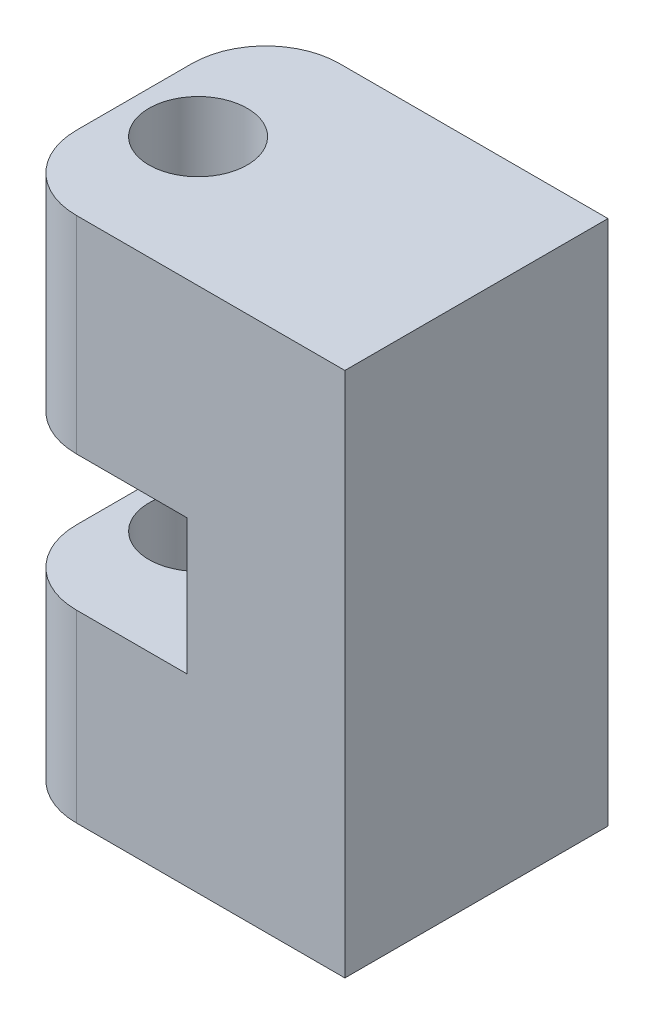
ISO-10303-21;
HEADER;
FILE_DESCRIPTION(('STEP AP214'),'2;1');
FILE_NAME('part.step','',(''),(''),'','','');
FILE_SCHEMA(('AUTOMOTIVE_DESIGN { 1 0 10303 214 1 1 1 1 }'));
ENDSEC;
DATA;
#1=APPLICATION_CONTEXT('core data for automotive mechanical design processes');
#2=APPLICATION_PROTOCOL_DEFINITION('international standard','automotive_design',2000,#1);
#3=PRODUCT_CONTEXT('',#1,'mechanical');
#4=PRODUCT('Part','Part','',(#3));
#5=PRODUCT_RELATED_PRODUCT_CATEGORY('part','',(#4));
#6=PRODUCT_DEFINITION_FORMATION('','',#4);
#7=PRODUCT_DEFINITION_CONTEXT('part definition',#1,'design');
#8=PRODUCT_DEFINITION('design','',#6,#7);
#9=PRODUCT_DEFINITION_SHAPE('','',#8);
#10=(LENGTH_UNIT() NAMED_UNIT(*) SI_UNIT(.MILLI.,.METRE.));
#11=(NAMED_UNIT(*) PLANE_ANGLE_UNIT() SI_UNIT($,.RADIAN.));
#12=(NAMED_UNIT(*) SI_UNIT($,.STERADIAN.) SOLID_ANGLE_UNIT());
#13=UNCERTAINTY_MEASURE_WITH_UNIT(LENGTH_MEASURE(1.E-05),#10,'distance_accuracy_value','');
#14=(GEOMETRIC_REPRESENTATION_CONTEXT(3) GLOBAL_UNCERTAINTY_ASSIGNED_CONTEXT((#13)) GLOBAL_UNIT_ASSIGNED_CONTEXT((#10,
#11,#12)) REPRESENTATION_CONTEXT('',''));
#15=CARTESIAN_POINT('',(0.,0.,0.));
#16=DIRECTION('',(0.,0.,1.));
#17=DIRECTION('',(1.,0.,0.));
#18=AXIS2_PLACEMENT_3D('',#15,#16,#17);
#19=CARTESIAN_POINT('',(0.,0.,-11.7));
#20=DIRECTION('',(0.,0.,-1.));
#21=DIRECTION('',(-1.,0.,0.));
#22=AXIS2_PLACEMENT_3D('',#19,#20,#21);
#23=PLANE('',#22);
#24=DIRECTION('',(0.,-1.,0.));
#25=VECTOR('',#24,1.);
#26=CARTESIAN_POINT('',(12.82,0.,-11.7));
#27=LINE('',#26,#25);
#28=CARTESIAN_POINT('',(12.82,23.4,-11.7));
#29=VERTEX_POINT('',#28);
#30=CARTESIAN_POINT('',(12.82,2.,-11.7));
#31=VERTEX_POINT('',#30);
#32=EDGE_CURVE('E162',#29,#31,#27,.T.);
#33=ORIENTED_EDGE('',*,*,#32,.T.);
#34=DIRECTION('',(-1.,0.,0.));
#35=VECTOR('',#34,1.);
#36=CARTESIAN_POINT('',(0.,2.,-11.7));
#37=LINE('',#36,#35);
#38=CARTESIAN_POINT('',(1.89997551417986,2.,-11.7));
#39=VERTEX_POINT('',#38);
#40=EDGE_CURVE('E176',#31,#39,#37,.T.);
#41=ORIENTED_EDGE('',*,*,#40,.T.);
#42=DIRECTION('',(0.,-1.,0.));
#43=VECTOR('',#42,1.);
#44=CARTESIAN_POINT('',(1.89997551417986,9.5,-11.7));
#45=LINE('',#44,#43);
#46=CARTESIAN_POINT('',(1.89997551417986,9.5,-11.7));
#47=VERTEX_POINT('',#46);
#48=EDGE_CURVE('E147',#39,#47,#45,.F.);
#49=ORIENTED_EDGE('',*,*,#48,.T.);
#50=DIRECTION('',(1.,0.,0.));
#51=VECTOR('',#50,1.);
#52=CARTESIAN_POINT('',(9.39997551417986,9.5,-11.7));
#53=LINE('',#52,#51);
#54=CARTESIAN_POINT('',(6.39997551417986,9.5,-11.7));
#55=VERTEX_POINT('',#54);
#56=EDGE_CURVE('E213',#47,#55,#53,.T.);
#57=ORIENTED_EDGE('',*,*,#56,.T.);
#58=DIRECTION('',(0.,-1.,0.));
#59=VECTOR('',#58,1.);
#60=CARTESIAN_POINT('',(6.39997551417986,15.,-11.7));
#61=LINE('',#60,#59);
#62=CARTESIAN_POINT('',(6.39997551417986,15.,-11.7));
#63=VERTEX_POINT('',#62);
#64=EDGE_CURVE('E191',#63,#55,#61,.T.);
#65=ORIENTED_EDGE('',*,*,#64,.F.);
#66=DIRECTION('',(-1.,0.,0.));
#67=VECTOR('',#66,1.);
#68=CARTESIAN_POINT('',(9.39997551417986,15.,-11.7));
#69=LINE('',#68,#67);
#70=CARTESIAN_POINT('',(1.89997551417986,15.,-11.7));
#71=VERTEX_POINT('',#70);
#72=EDGE_CURVE('E209',#63,#71,#69,.T.);
#73=ORIENTED_EDGE('',*,*,#72,.T.);
#74=DIRECTION('',(0.,-1.,0.));
#75=VECTOR('',#74,1.);
#76=CARTESIAN_POINT('',(1.89997551417986,25.4,-11.7));
#77=LINE('',#76,#75);
#78=CARTESIAN_POINT('',(1.89997551417986,23.4,-11.7));
#79=VERTEX_POINT('',#78);
#80=EDGE_CURVE('E143',#71,#79,#77,.F.);
#81=ORIENTED_EDGE('',*,*,#80,.T.);
#82=DIRECTION('',(1.,0.,0.));
#83=VECTOR('',#82,1.);
#84=CARTESIAN_POINT('',(0.,23.4,-11.7));
#85=LINE('',#84,#83);
#86=EDGE_CURVE('E180',#79,#29,#85,.T.);
#87=ORIENTED_EDGE('',*,*,#86,.T.);
#88=EDGE_LOOP('',(#33,#41,#49,#57,#65,#73,#81,#87));
#89=FACE_BOUND('',#88,.T.);
#90=ADVANCED_FACE('F38',(#89),#23,.T.);
#91=CARTESIAN_POINT('',(0.,0.,-1.));
#92=DIRECTION('',(0.,0.,-1.));
#93=DIRECTION('',(-1.,0.,0.));
#94=AXIS2_PLACEMENT_3D('',#91,#92,#93);
#95=PLANE('',#94);
#96=DIRECTION('',(-1.,0.,0.));
#97=VECTOR('',#96,1.);
#98=CARTESIAN_POINT('',(0.,2.,-1.));
#99=LINE('',#98,#97);
#100=CARTESIAN_POINT('',(12.82,2.,-1.));
#101=VERTEX_POINT('',#100);
#102=CARTESIAN_POINT('',(1.89997551417986,2.,-1.));
#103=VERTEX_POINT('',#102);
#104=EDGE_CURVE('E53',#101,#103,#99,.T.);
#105=ORIENTED_EDGE('',*,*,#104,.F.);
#106=DIRECTION('',(0.,-1.,0.));
#107=VECTOR('',#106,1.);
#108=CARTESIAN_POINT('',(12.82,0.,-1.));
#109=LINE('',#108,#107);
#110=CARTESIAN_POINT('',(12.82,23.4,-1.));
#111=VERTEX_POINT('',#110);
#112=EDGE_CURVE('E154',#111,#101,#109,.T.);
#113=ORIENTED_EDGE('',*,*,#112,.F.);
#114=DIRECTION('',(1.,0.,0.));
#115=VECTOR('',#114,1.);
#116=CARTESIAN_POINT('',(0.,23.4,-1.));
#117=LINE('',#116,#115);
#118=CARTESIAN_POINT('',(1.89997551417986,23.4,-1.));
#119=VERTEX_POINT('',#118);
#120=EDGE_CURVE('E60',#119,#111,#117,.T.);
#121=ORIENTED_EDGE('',*,*,#120,.F.);
#122=DIRECTION('',(0.,1.,0.));
#123=VECTOR('',#122,1.);
#124=CARTESIAN_POINT('',(1.89997551417986,0.,-1.));
#125=LINE('',#124,#123);
#126=CARTESIAN_POINT('',(1.89997551417986,15.,-1.));
#127=VERTEX_POINT('',#126);
#128=EDGE_CURVE('E224',#119,#127,#125,.F.);
#129=ORIENTED_EDGE('',*,*,#128,.T.);
#130=DIRECTION('',(-1.,0.,0.));
#131=VECTOR('',#130,1.);
#132=CARTESIAN_POINT('',(9.39997551417986,15.,-1.));
#133=LINE('',#132,#131);
#134=CARTESIAN_POINT('',(6.39997551417986,15.,-1.));
#135=VERTEX_POINT('',#134);
#136=EDGE_CURVE('E208',#135,#127,#133,.T.);
#137=ORIENTED_EDGE('',*,*,#136,.F.);
#138=DIRECTION('',(0.,1.,0.));
#139=VECTOR('',#138,1.);
#140=CARTESIAN_POINT('',(6.39997551417986,15.,-1.));
#141=LINE('',#140,#139);
#142=CARTESIAN_POINT('',(6.39997551417986,9.5,-1.));
#143=VERTEX_POINT('',#142);
#144=EDGE_CURVE('E197',#143,#135,#141,.T.);
#145=ORIENTED_EDGE('',*,*,#144,.F.);
#146=DIRECTION('',(1.,0.,0.));
#147=VECTOR('',#146,1.);
#148=CARTESIAN_POINT('',(9.39997551417986,9.5,-1.));
#149=LINE('',#148,#147);
#150=CARTESIAN_POINT('',(1.89997551417986,9.5,-1.));
#151=VERTEX_POINT('',#150);
#152=EDGE_CURVE('E215',#151,#143,#149,.T.);
#153=ORIENTED_EDGE('',*,*,#152,.F.);
#154=DIRECTION('',(0.,1.,0.));
#155=VECTOR('',#154,1.);
#156=CARTESIAN_POINT('',(1.89997551417986,0.,-1.));
#157=LINE('',#156,#155);
#158=EDGE_CURVE('E168',#151,#103,#157,.F.);
#159=ORIENTED_EDGE('',*,*,#158,.T.);
#160=EDGE_LOOP('',(#105,#113,#121,#129,#137,#145,#153,#159));
#161=FACE_BOUND('',#160,.T.);
#162=ADVANCED_FACE('F165',(#161),#95,.F.);
#163=CARTESIAN_POINT('',(12.82,0.,0.));
#164=DIRECTION('',(1.,0.,0.));
#165=DIRECTION('',(0.,0.,-1.));
#166=AXIS2_PLACEMENT_3D('',#163,#164,#165);
#167=PLANE('',#166);
#168=ORIENTED_EDGE('',*,*,#112,.T.);
#169=DIRECTION('',(0.,0.,-1.));
#170=VECTOR('',#169,1.);
#171=CARTESIAN_POINT('',(12.82,2.,0.));
#172=LINE('',#171,#170);
#173=EDGE_CURVE('E171',#101,#31,#172,.T.);
#174=ORIENTED_EDGE('',*,*,#173,.T.);
#175=ORIENTED_EDGE('',*,*,#32,.F.);
#176=DIRECTION('',(0.,0.,1.));
#177=VECTOR('',#176,1.);
#178=CARTESIAN_POINT('',(12.82,23.4,0.));
#179=LINE('',#178,#177);
#180=EDGE_CURVE('E46',#29,#111,#179,.T.);
#181=ORIENTED_EDGE('',*,*,#180,.T.);
#182=EDGE_LOOP('',(#168,#174,#175,#181));
#183=FACE_BOUND('',#182,.T.);
#184=ADVANCED_FACE('F159',(#183),#167,.T.);
#185=CARTESIAN_POINT('',(-1.10002448582014,0.,0.));
#186=DIRECTION('',(1.,0.,0.));
#187=DIRECTION('',(0.,0.,-1.));
#188=AXIS2_PLACEMENT_3D('',#185,#186,#187);
#189=PLANE('',#188);
#190=DIRECTION('',(0.,0.,-1.));
#191=VECTOR('',#190,1.);
#192=CARTESIAN_POINT('',(-1.10002448582014,2.,0.));
#193=LINE('',#192,#191);
#194=CARTESIAN_POINT('',(-1.10002448582014,2.,-4.));
#195=VERTEX_POINT('',#194);
#196=CARTESIAN_POINT('',(-1.10002448582014,2.,-8.7));
#197=VERTEX_POINT('',#196);
#198=EDGE_CURVE('E125',#195,#197,#193,.T.);
#199=ORIENTED_EDGE('',*,*,#198,.F.);
#200=DIRECTION('',(0.,1.,0.));
#201=VECTOR('',#200,1.);
#202=CARTESIAN_POINT('',(-1.10002448582014,0.,-4.));
#203=LINE('',#202,#201);
#204=CARTESIAN_POINT('',(-1.10002448582014,9.5,-4.));
#205=VERTEX_POINT('',#204);
#206=EDGE_CURVE('E135',#195,#205,#203,.T.);
#207=ORIENTED_EDGE('',*,*,#206,.T.);
#208=DIRECTION('',(0.,0.,-1.));
#209=VECTOR('',#208,1.);
#210=CARTESIAN_POINT('',(-1.10002448582014,9.5,-11.7));
#211=LINE('',#210,#209);
#212=CARTESIAN_POINT('',(-1.10002448582014,9.5,-8.7));
#213=VERTEX_POINT('',#212);
#214=EDGE_CURVE('E206',#205,#213,#211,.T.);
#215=ORIENTED_EDGE('',*,*,#214,.T.);
#216=DIRECTION('',(0.,-1.,0.));
#217=VECTOR('',#216,1.);
#218=CARTESIAN_POINT('',(-1.10002448582014,0.,-8.7));
#219=LINE('',#218,#217);
#220=EDGE_CURVE('E138',#213,#197,#219,.T.);
#221=ORIENTED_EDGE('',*,*,#220,.T.);
#222=EDGE_LOOP('',(#199,#207,#215,#221));
#223=FACE_BOUND('',#222,.T.);
#224=ADVANCED_FACE('F133',(#223),#189,.F.);
#225=CARTESIAN_POINT('',(1.89997551417986,0.,-8.7));
#226=DIRECTION('',(0.,1.,0.));
#227=DIRECTION('',(0.,0.,1.));
#228=AXIS2_PLACEMENT_3D('',#225,#226,#227);
#229=CYLINDRICAL_SURFACE('',#228,3.);
#230=ORIENTED_EDGE('',*,*,#48,.F.);
#231=CARTESIAN_POINT('',(1.89997551417986,2.,-8.7));
#232=DIRECTION('',(0.,-1.,0.));
#233=DIRECTION('',(0.,0.,-1.));
#234=AXIS2_PLACEMENT_3D('',#231,#232,#233);
#235=CIRCLE('',#234,3.);
#236=EDGE_CURVE('E169',#39,#197,#235,.F.);
#237=ORIENTED_EDGE('',*,*,#236,.T.);
#238=ORIENTED_EDGE('',*,*,#220,.F.);
#239=CARTESIAN_POINT('',(1.89997551417986,9.5,-8.7));
#240=DIRECTION('',(0.,-1.,0.));
#241=DIRECTION('',(0.,0.,-1.));
#242=AXIS2_PLACEMENT_3D('',#239,#240,#241);
#243=CIRCLE('',#242,3.);
#244=EDGE_CURVE('E152',#47,#213,#243,.F.);
#245=ORIENTED_EDGE('',*,*,#244,.F.);
#246=EDGE_LOOP('',(#230,#237,#238,#245));
#247=FACE_BOUND('',#246,.T.);
#248=ADVANCED_FACE('F238',(#247),#229,.T.);
#249=CARTESIAN_POINT('',(1.89997551417986,0.,-4.));
#250=DIRECTION('',(0.,1.,0.));
#251=DIRECTION('',(0.,0.,1.));
#252=AXIS2_PLACEMENT_3D('',#249,#250,#251);
#253=CYLINDRICAL_SURFACE('',#252,3.);
#254=ORIENTED_EDGE('',*,*,#206,.F.);
#255=CARTESIAN_POINT('',(1.89997551417986,2.,-4.));
#256=DIRECTION('',(0.,-1.,0.));
#257=DIRECTION('',(0.,0.,-1.));
#258=AXIS2_PLACEMENT_3D('',#255,#256,#257);
#259=CIRCLE('',#258,3.);
#260=EDGE_CURVE('E11',#195,#103,#259,.F.);
#261=ORIENTED_EDGE('',*,*,#260,.T.);
#262=ORIENTED_EDGE('',*,*,#158,.F.);
#263=CARTESIAN_POINT('',(1.89997551417986,9.5,-4.));
#264=DIRECTION('',(0.,-1.,0.));
#265=DIRECTION('',(0.,0.,-1.));
#266=AXIS2_PLACEMENT_3D('',#263,#264,#265);
#267=CIRCLE('',#266,3.);
#268=EDGE_CURVE('E141',#205,#151,#267,.F.);
#269=ORIENTED_EDGE('',*,*,#268,.F.);
#270=EDGE_LOOP('',(#254,#261,#262,#269));
#271=FACE_BOUND('',#270,.T.);
#272=ADVANCED_FACE('F40',(#271),#253,.T.);
#273=CARTESIAN_POINT('',(-1.10002448582014,0.,0.));
#274=DIRECTION('',(1.,0.,0.));
#275=DIRECTION('',(0.,0.,-1.));
#276=AXIS2_PLACEMENT_3D('',#273,#274,#275);
#277=PLANE('',#276);
#278=DIRECTION('',(0.,0.,1.));
#279=VECTOR('',#278,1.);
#280=CARTESIAN_POINT('',(-1.10002448582014,23.4,0.));
#281=LINE('',#280,#279);
#282=CARTESIAN_POINT('',(-1.10002448582014,23.4,-8.7));
#283=VERTEX_POINT('',#282);
#284=CARTESIAN_POINT('',(-1.10002448582014,23.4,-4.));
#285=VERTEX_POINT('',#284);
#286=EDGE_CURVE('E188',#283,#285,#281,.T.);
#287=ORIENTED_EDGE('',*,*,#286,.F.);
#288=DIRECTION('',(0.,-1.,0.));
#289=VECTOR('',#288,1.);
#290=CARTESIAN_POINT('',(-1.10002448582014,15.,-8.7));
#291=LINE('',#290,#289);
#292=CARTESIAN_POINT('',(-1.10002448582014,15.,-8.7));
#293=VERTEX_POINT('',#292);
#294=EDGE_CURVE('E212',#283,#293,#291,.T.);
#295=ORIENTED_EDGE('',*,*,#294,.T.);
#296=DIRECTION('',(0.,0.,1.));
#297=VECTOR('',#296,1.);
#298=CARTESIAN_POINT('',(-1.10002448582014,15.,-11.7));
#299=LINE('',#298,#297);
#300=CARTESIAN_POINT('',(-1.10002448582014,15.,-4.));
#301=VERTEX_POINT('',#300);
#302=EDGE_CURVE('E203',#293,#301,#299,.T.);
#303=ORIENTED_EDGE('',*,*,#302,.T.);
#304=DIRECTION('',(0.,1.,0.));
#305=VECTOR('',#304,1.);
#306=CARTESIAN_POINT('',(-1.10002448582014,0.,-4.));
#307=LINE('',#306,#305);
#308=EDGE_CURVE('E220',#301,#285,#307,.T.);
#309=ORIENTED_EDGE('',*,*,#308,.T.);
#310=EDGE_LOOP('',(#287,#295,#303,#309));
#311=FACE_BOUND('',#310,.T.);
#312=ADVANCED_FACE('F248',(#311),#277,.F.);
#313=CARTESIAN_POINT('',(1.89997551417986,0.,-4.));
#314=DIRECTION('',(0.,1.,0.));
#315=DIRECTION('',(0.,0.,1.));
#316=AXIS2_PLACEMENT_3D('',#313,#314,#315);
#317=CYLINDRICAL_SURFACE('',#316,3.);
#318=ORIENTED_EDGE('',*,*,#128,.F.);
#319=CARTESIAN_POINT('',(1.89997551417986,23.4,-4.));
#320=DIRECTION('',(0.,1.,0.));
#321=DIRECTION('',(0.,0.,1.));
#322=AXIS2_PLACEMENT_3D('',#319,#320,#321);
#323=CIRCLE('',#322,3.);
#324=EDGE_CURVE('E185',#119,#285,#323,.F.);
#325=ORIENTED_EDGE('',*,*,#324,.T.);
#326=ORIENTED_EDGE('',*,*,#308,.F.);
#327=CARTESIAN_POINT('',(1.89997551417986,15.,-4.));
#328=DIRECTION('',(0.,1.,0.));
#329=DIRECTION('',(0.,0.,1.));
#330=AXIS2_PLACEMENT_3D('',#327,#328,#329);
#331=CIRCLE('',#330,3.);
#332=EDGE_CURVE('E228',#127,#301,#331,.F.);
#333=ORIENTED_EDGE('',*,*,#332,.F.);
#334=EDGE_LOOP('',(#318,#325,#326,#333));
#335=FACE_BOUND('',#334,.T.);
#336=ADVANCED_FACE('F251',(#335),#317,.T.);
#337=CARTESIAN_POINT('',(1.89997551417986,0.,-8.7));
#338=DIRECTION('',(0.,1.,0.));
#339=DIRECTION('',(0.,0.,1.));
#340=AXIS2_PLACEMENT_3D('',#337,#338,#339);
#341=CYLINDRICAL_SURFACE('',#340,3.);
#342=ORIENTED_EDGE('',*,*,#294,.F.);
#343=CARTESIAN_POINT('',(1.89997551417986,23.4,-8.7));
#344=DIRECTION('',(0.,1.,0.));
#345=DIRECTION('',(0.,0.,1.));
#346=AXIS2_PLACEMENT_3D('',#343,#344,#345);
#347=CIRCLE('',#346,3.);
#348=EDGE_CURVE('E182',#283,#79,#347,.F.);
#349=ORIENTED_EDGE('',*,*,#348,.T.);
#350=ORIENTED_EDGE('',*,*,#80,.F.);
#351=CARTESIAN_POINT('',(1.89997551417986,15.,-8.7));
#352=DIRECTION('',(0.,1.,0.));
#353=DIRECTION('',(0.,0.,1.));
#354=AXIS2_PLACEMENT_3D('',#351,#352,#353);
#355=CIRCLE('',#354,3.);
#356=EDGE_CURVE('E226',#293,#71,#355,.F.);
#357=ORIENTED_EDGE('',*,*,#356,.F.);
#358=EDGE_LOOP('',(#342,#349,#350,#357));
#359=FACE_BOUND('',#358,.T.);
#360=ADVANCED_FACE('F244',(#359),#341,.T.);
#361=CARTESIAN_POINT('',(9.39997551417986,15.,-15.665098237759));
#362=DIRECTION('',(0.,1.,0.));
#363=DIRECTION('',(0.,0.,1.));
#364=AXIS2_PLACEMENT_3D('',#361,#362,#363);
#365=PLANE('',#364);
#366=CARTESIAN_POINT('',(1.59997551417986,15.,-6.25));
#367=DIRECTION('',(0.,1.,0.));
#368=DIRECTION('',(0.,0.,1.));
#369=AXIS2_PLACEMENT_3D('',#366,#367,#368);
#370=CIRCLE('',#369,2.);
#371=CARTESIAN_POINT('',(1.59997551417986,15.,-4.25));
#372=VERTEX_POINT('',#371);
#373=EDGE_CURVE('E139',#372,#372,#370,.T.);
#374=ORIENTED_EDGE('',*,*,#373,.T.);
#375=EDGE_LOOP('',(#374));
#376=FACE_BOUND('',#375,.T.);
#377=ORIENTED_EDGE('',*,*,#136,.T.);
#378=ORIENTED_EDGE('',*,*,#332,.T.);
#379=ORIENTED_EDGE('',*,*,#302,.F.);
#380=ORIENTED_EDGE('',*,*,#356,.T.);
#381=ORIENTED_EDGE('',*,*,#72,.F.);
#382=DIRECTION('',(0.,0.,-1.));
#383=VECTOR('',#382,1.);
#384=CARTESIAN_POINT('',(6.39997551417986,15.,-11.7));
#385=LINE('',#384,#383);
#386=EDGE_CURVE('E200',#135,#63,#385,.T.);
#387=ORIENTED_EDGE('',*,*,#386,.F.);
#388=EDGE_LOOP('',(#377,#378,#379,#380,#381,#387));
#389=FACE_BOUND('',#388,.T.);
#390=ADVANCED_FACE('F256',(#376,#389),#365,.F.);
#391=CARTESIAN_POINT('',(9.39997551417986,9.5,-15.665098237759));
#392=DIRECTION('',(0.,-1.,0.));
#393=DIRECTION('',(0.,0.,-1.));
#394=AXIS2_PLACEMENT_3D('',#391,#392,#393);
#395=PLANE('',#394);
#396=CARTESIAN_POINT('',(1.59997551417986,9.5,-6.25));
#397=DIRECTION('',(0.,-1.,0.));
#398=DIRECTION('',(0.,0.,-1.));
#399=AXIS2_PLACEMENT_3D('',#396,#397,#398);
#400=CIRCLE('',#399,2.);
#401=CARTESIAN_POINT('',(1.59997551417986,9.5,-8.25));
#402=VERTEX_POINT('',#401);
#403=EDGE_CURVE('E317',#402,#402,#400,.T.);
#404=ORIENTED_EDGE('',*,*,#403,.T.);
#405=EDGE_LOOP('',(#404));
#406=FACE_BOUND('',#405,.T.);
#407=ORIENTED_EDGE('',*,*,#56,.F.);
#408=ORIENTED_EDGE('',*,*,#244,.T.);
#409=ORIENTED_EDGE('',*,*,#214,.F.);
#410=ORIENTED_EDGE('',*,*,#268,.T.);
#411=ORIENTED_EDGE('',*,*,#152,.T.);
#412=DIRECTION('',(0.,0.,1.));
#413=VECTOR('',#412,1.);
#414=CARTESIAN_POINT('',(6.39997551417986,9.5,-11.7));
#415=LINE('',#414,#413);
#416=EDGE_CURVE('E194',#55,#143,#415,.T.);
#417=ORIENTED_EDGE('',*,*,#416,.F.);
#418=EDGE_LOOP('',(#407,#408,#409,#410,#411,#417));
#419=FACE_BOUND('',#418,.T.);
#420=ADVANCED_FACE('F237',(#406,#419),#395,.F.);
#421=CARTESIAN_POINT('',(6.39997551417986,0.,0.));
#422=DIRECTION('',(-1.,0.,0.));
#423=DIRECTION('',(0.,0.,1.));
#424=AXIS2_PLACEMENT_3D('',#421,#422,#423);
#425=PLANE('',#424);
#426=ORIENTED_EDGE('',*,*,#64,.T.);
#427=ORIENTED_EDGE('',*,*,#416,.T.);
#428=ORIENTED_EDGE('',*,*,#144,.T.);
#429=ORIENTED_EDGE('',*,*,#386,.T.);
#430=EDGE_LOOP('',(#426,#427,#428,#429));
#431=FACE_BOUND('',#430,.T.);
#432=ADVANCED_FACE('F258',(#431),#425,.T.);
#433=CARTESIAN_POINT('',(0.,23.4,0.));
#434=DIRECTION('',(0.,1.,0.));
#435=DIRECTION('',(0.,0.,1.));
#436=AXIS2_PLACEMENT_3D('',#433,#434,#435);
#437=PLANE('',#436);
#438=CARTESIAN_POINT('',(1.59997551417986,23.4,-6.25));
#439=DIRECTION('',(0.,1.,0.));
#440=DIRECTION('',(0.,0.,1.));
#441=AXIS2_PLACEMENT_3D('',#438,#439,#440);
#442=CIRCLE('',#441,2.);
#443=CARTESIAN_POINT('',(1.59997551417986,23.4,-4.25));
#444=VERTEX_POINT('',#443);
#445=EDGE_CURVE('E314',#444,#444,#442,.T.);
#446=ORIENTED_EDGE('',*,*,#445,.F.);
#447=EDGE_LOOP('',(#446));
#448=FACE_BOUND('',#447,.T.);
#449=ORIENTED_EDGE('',*,*,#286,.T.);
#450=ORIENTED_EDGE('',*,*,#324,.F.);
#451=ORIENTED_EDGE('',*,*,#120,.T.);
#452=ORIENTED_EDGE('',*,*,#180,.F.);
#453=ORIENTED_EDGE('',*,*,#86,.F.);
#454=ORIENTED_EDGE('',*,*,#348,.F.);
#455=EDGE_LOOP('',(#449,#450,#451,#452,#453,#454));
#456=FACE_BOUND('',#455,.T.);
#457=ADVANCED_FACE('F240',(#448,#456),#437,.T.);
#458=CARTESIAN_POINT('',(0.,2.,0.));
#459=DIRECTION('',(0.,-1.,0.));
#460=DIRECTION('',(0.,0.,-1.));
#461=AXIS2_PLACEMENT_3D('',#458,#459,#460);
#462=PLANE('',#461);
#463=CARTESIAN_POINT('',(1.59997551417986,2.,-6.25));
#464=DIRECTION('',(0.,-1.,0.));
#465=DIRECTION('',(0.,0.,-1.));
#466=AXIS2_PLACEMENT_3D('',#463,#464,#465);
#467=CIRCLE('',#466,2.);
#468=CARTESIAN_POINT('',(1.59997551417986,2.,-8.25));
#469=VERTEX_POINT('',#468);
#470=EDGE_CURVE('E322',#469,#469,#467,.T.);
#471=ORIENTED_EDGE('',*,*,#470,.F.);
#472=EDGE_LOOP('',(#471));
#473=FACE_BOUND('',#472,.T.);
#474=ORIENTED_EDGE('',*,*,#173,.F.);
#475=ORIENTED_EDGE('',*,*,#104,.T.);
#476=ORIENTED_EDGE('',*,*,#260,.F.);
#477=ORIENTED_EDGE('',*,*,#198,.T.);
#478=ORIENTED_EDGE('',*,*,#236,.F.);
#479=ORIENTED_EDGE('',*,*,#40,.F.);
#480=EDGE_LOOP('',(#474,#475,#476,#477,#478,#479));
#481=FACE_BOUND('',#480,.T.);
#482=ADVANCED_FACE('F124',(#473,#481),#462,.T.);
#483=CARTESIAN_POINT('',(1.59997551417986,26.,-6.25));
#484=DIRECTION('',(0.,-1.,0.));
#485=DIRECTION('',(0.,0.,-1.));
#486=AXIS2_PLACEMENT_3D('',#483,#484,#485);
#487=CYLINDRICAL_SURFACE('',#486,2.);
#488=ORIENTED_EDGE('',*,*,#470,.T.);
#489=EDGE_LOOP('',(#488));
#490=FACE_BOUND('',#489,.T.);
#491=ORIENTED_EDGE('',*,*,#403,.F.);
#492=EDGE_LOOP('',(#491));
#493=FACE_BOUND('',#492,.T.);
#494=ADVANCED_FACE('F302',(#490,#493),#487,.F.);
#495=ORIENTED_EDGE('',*,*,#445,.T.);
#496=EDGE_LOOP('',(#495));
#497=FACE_BOUND('',#496,.T.);
#498=ORIENTED_EDGE('',*,*,#373,.F.);
#499=EDGE_LOOP('',(#498));
#500=FACE_BOUND('',#499,.T.);
#501=ADVANCED_FACE('F304',(#497,#500),#487,.F.);
#502=CLOSED_SHELL('',(#90,#162,#184,#224,#248,#272,#312,#336,#360,#390,#420,#432,#457,#482,#494,#501));
#503=MANIFOLD_SOLID_BREP('B2',#502);
#504=ADVANCED_BREP_SHAPE_REPRESENTATION('',(#18,#503),#14);
#505=SHAPE_DEFINITION_REPRESENTATION(#9,#504);
ENDSEC;
END-ISO-10303-21;
